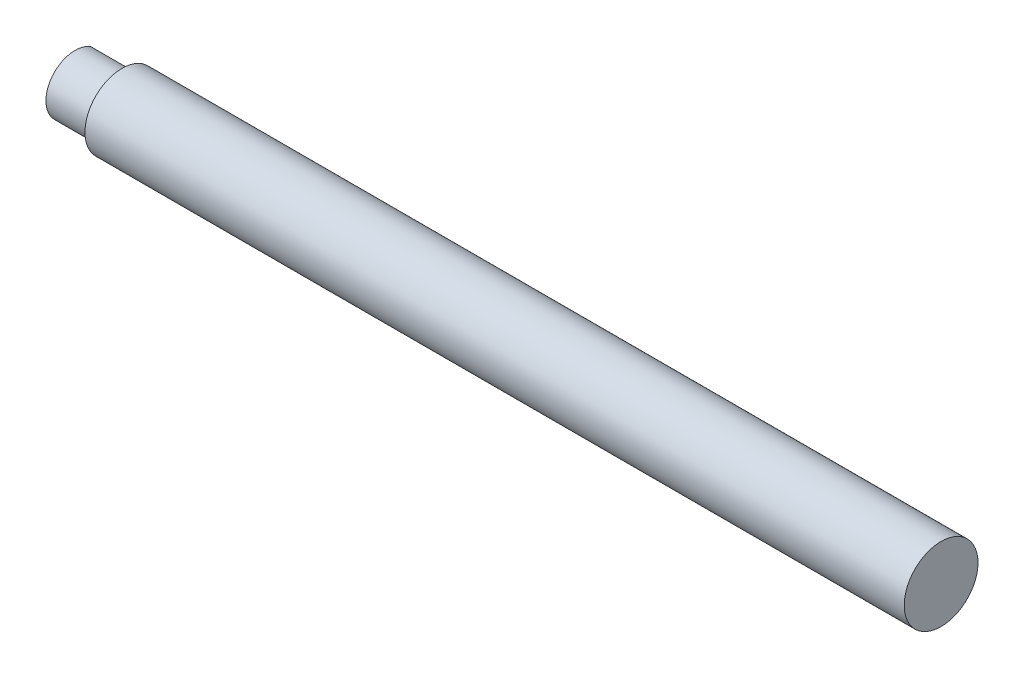
ISO-10303-21;
HEADER;
FILE_DESCRIPTION(('STEP AP214'),'2;1');
FILE_NAME('part.step','',(''),(''),'','','');
FILE_SCHEMA(('AUTOMOTIVE_DESIGN { 1 0 10303 214 1 1 1 1 }'));
ENDSEC;
DATA;
#1=APPLICATION_CONTEXT('core data for automotive mechanical design processes');
#2=APPLICATION_PROTOCOL_DEFINITION('international standard','automotive_design',2000,#1);
#3=PRODUCT_CONTEXT('',#1,'mechanical');
#4=PRODUCT('Part','Part','',(#3));
#5=PRODUCT_RELATED_PRODUCT_CATEGORY('part','',(#4));
#6=PRODUCT_DEFINITION_FORMATION('','',#4);
#7=PRODUCT_DEFINITION_CONTEXT('part definition',#1,'design');
#8=PRODUCT_DEFINITION('design','',#6,#7);
#9=PRODUCT_DEFINITION_SHAPE('','',#8);
#10=(LENGTH_UNIT() NAMED_UNIT(*) SI_UNIT(.MILLI.,.METRE.));
#11=(NAMED_UNIT(*) PLANE_ANGLE_UNIT() SI_UNIT($,.RADIAN.));
#12=(NAMED_UNIT(*) SI_UNIT($,.STERADIAN.) SOLID_ANGLE_UNIT());
#13=UNCERTAINTY_MEASURE_WITH_UNIT(LENGTH_MEASURE(1.E-05),#10,'distance_accuracy_value','');
#14=(GEOMETRIC_REPRESENTATION_CONTEXT(3) GLOBAL_UNCERTAINTY_ASSIGNED_CONTEXT((#13)) GLOBAL_UNIT_ASSIGNED_CONTEXT((#10,
#11,#12)) REPRESENTATION_CONTEXT('',''));
#15=CARTESIAN_POINT('',(0.,0.,0.));
#16=DIRECTION('',(0.,0.,1.));
#17=DIRECTION('',(1.,0.,0.));
#18=AXIS2_PLACEMENT_3D('',#15,#16,#17);
#19=CARTESIAN_POINT('',(58.674,0.,0.));
#20=DIRECTION('',(-1.,0.,0.));
#21=DIRECTION('',(0.,0.,1.));
#22=AXIS2_PLACEMENT_3D('',#19,#20,#21);
#23=CYLINDRICAL_SURFACE('',#22,2.5);
#24=CARTESIAN_POINT('',(3.175,0.,0.));
#25=DIRECTION('',(1.,0.,0.));
#26=DIRECTION('',(0.,0.,-1.));
#27=AXIS2_PLACEMENT_3D('',#24,#25,#26);
#28=CIRCLE('',#27,2.5);
#29=CARTESIAN_POINT('',(3.175,0.,-2.5));
#30=VERTEX_POINT('',#29);
#31=EDGE_CURVE('E37',#30,#30,#28,.T.);
#32=ORIENTED_EDGE('',*,*,#31,.T.);
#33=EDGE_LOOP('',(#32));
#34=FACE_BOUND('',#33,.T.);
#35=CARTESIAN_POINT('',(58.674,0.,0.));
#36=DIRECTION('',(1.,0.,0.));
#37=DIRECTION('',(0.,0.,-1.));
#38=AXIS2_PLACEMENT_3D('',#35,#36,#37);
#39=CIRCLE('',#38,2.5);
#40=CARTESIAN_POINT('',(58.674,0.,-2.5));
#41=VERTEX_POINT('',#40);
#42=EDGE_CURVE('E12',#41,#41,#39,.T.);
#43=ORIENTED_EDGE('',*,*,#42,.F.);
#44=EDGE_LOOP('',(#43));
#45=FACE_BOUND('',#44,.T.);
#46=ADVANCED_FACE('F34',(#34,#45),#23,.T.);
#47=CARTESIAN_POINT('',(58.674,0.,0.));
#48=DIRECTION('',(1.,0.,0.));
#49=DIRECTION('',(0.,0.,-1.));
#50=AXIS2_PLACEMENT_3D('',#47,#48,#49);
#51=PLANE('',#50);
#52=ORIENTED_EDGE('',*,*,#42,.T.);
#53=EDGE_LOOP('',(#52));
#54=FACE_BOUND('',#53,.T.);
#55=ADVANCED_FACE('F83',(#54),#51,.T.);
#56=CARTESIAN_POINT('',(3.175,0.,0.));
#57=DIRECTION('',(1.,0.,0.));
#58=DIRECTION('',(0.,0.,-1.));
#59=AXIS2_PLACEMENT_3D('',#56,#57,#58);
#60=PLANE('',#59);
#61=DIRECTION('',(0.,1.,0.));
#62=VECTOR('',#61,1.);
#63=CARTESIAN_POINT('',(3.175,1.6461081373956,-1.0795));
#64=LINE('',#63,#62);
#65=CARTESIAN_POINT('',(3.175,-1.6461081373956,-1.0795));
#66=VERTEX_POINT('',#65);
#67=CARTESIAN_POINT('',(3.175,1.6461081373956,-1.0795));
#68=VERTEX_POINT('',#67);
#69=EDGE_CURVE('E60',#66,#68,#64,.T.);
#70=ORIENTED_EDGE('',*,*,#69,.T.);
#71=CARTESIAN_POINT('',(3.175,0.,0.));
#72=DIRECTION('',(1.,0.,0.));
#73=DIRECTION('',(0.,0.,-1.));
#74=AXIS2_PLACEMENT_3D('',#71,#72,#73);
#75=CIRCLE('',#74,1.9685);
#76=EDGE_CURVE('E64',#68,#66,#75,.T.);
#77=ORIENTED_EDGE('',*,*,#76,.T.);
#78=EDGE_LOOP('',(#70,#77));
#79=FACE_BOUND('',#78,.T.);
#80=ORIENTED_EDGE('',*,*,#31,.F.);
#81=EDGE_LOOP('',(#80));
#82=FACE_BOUND('',#81,.T.);
#83=ADVANCED_FACE('F62',(#79,#82),#60,.F.);
#84=CARTESIAN_POINT('',(3.175,0.,0.));
#85=DIRECTION('',(-1.,0.,0.));
#86=DIRECTION('',(0.,0.,1.));
#87=AXIS2_PLACEMENT_3D('',#84,#85,#86);
#88=CYLINDRICAL_SURFACE('',#87,1.9685);
#89=CARTESIAN_POINT('',(0.,0.,0.));
#90=DIRECTION('',(1.,0.,0.));
#91=DIRECTION('',(0.,0.,-1.));
#92=AXIS2_PLACEMENT_3D('',#89,#90,#91);
#93=CIRCLE('',#92,1.9685);
#94=CARTESIAN_POINT('',(0.,1.6461081373956,-1.0795));
#95=VERTEX_POINT('',#94);
#96=CARTESIAN_POINT('',(0.,-1.6461081373956,-1.0795));
#97=VERTEX_POINT('',#96);
#98=EDGE_CURVE('E48',#95,#97,#93,.T.);
#99=ORIENTED_EDGE('',*,*,#98,.T.);
#100=DIRECTION('',(-1.,0.,0.));
#101=VECTOR('',#100,1.);
#102=CARTESIAN_POINT('',(3.175,-1.6461081373956,-1.0795));
#103=LINE('',#102,#101);
#104=EDGE_CURVE('E52',#66,#97,#103,.T.);
#105=ORIENTED_EDGE('',*,*,#104,.F.);
#106=ORIENTED_EDGE('',*,*,#76,.F.);
#107=DIRECTION('',(-1.,0.,0.));
#108=VECTOR('',#107,1.);
#109=CARTESIAN_POINT('',(3.175,1.6461081373956,-1.0795));
#110=LINE('',#109,#108);
#111=EDGE_CURVE('E66',#68,#95,#110,.T.);
#112=ORIENTED_EDGE('',*,*,#111,.T.);
#113=EDGE_LOOP('',(#99,#105,#106,#112));
#114=FACE_BOUND('',#113,.T.);
#115=ADVANCED_FACE('F73',(#114),#88,.T.);
#116=CARTESIAN_POINT('',(3.175,1.6461081373956,-1.0795));
#117=DIRECTION('',(0.,0.,1.));
#118=DIRECTION('',(1.,0.,0.));
#119=AXIS2_PLACEMENT_3D('',#116,#117,#118);
#120=PLANE('',#119);
#121=DIRECTION('',(0.,1.,0.));
#122=VECTOR('',#121,1.);
#123=CARTESIAN_POINT('',(0.,1.6461081373956,-1.0795));
#124=LINE('',#123,#122);
#125=EDGE_CURVE('E71',#97,#95,#124,.T.);
#126=ORIENTED_EDGE('',*,*,#125,.T.);
#127=ORIENTED_EDGE('',*,*,#111,.F.);
#128=ORIENTED_EDGE('',*,*,#69,.F.);
#129=ORIENTED_EDGE('',*,*,#104,.T.);
#130=EDGE_LOOP('',(#126,#127,#128,#129));
#131=FACE_BOUND('',#130,.T.);
#132=ADVANCED_FACE('F69',(#131),#120,.F.);
#133=CARTESIAN_POINT('',(0.,0.,0.));
#134=DIRECTION('',(1.,0.,0.));
#135=DIRECTION('',(0.,0.,-1.));
#136=AXIS2_PLACEMENT_3D('',#133,#134,#135);
#137=PLANE('',#136);
#138=ORIENTED_EDGE('',*,*,#125,.F.);
#139=ORIENTED_EDGE('',*,*,#98,.F.);
#140=EDGE_LOOP('',(#138,#139));
#141=FACE_BOUND('',#140,.T.);
#142=ADVANCED_FACE('F106',(#141),#137,.F.);
#143=CLOSED_SHELL('',(#46,#55,#83,#115,#132,#142));
#144=MANIFOLD_SOLID_BREP('B2',#143);
#145=ADVANCED_BREP_SHAPE_REPRESENTATION('',(#18,#144),#14);
#146=SHAPE_DEFINITION_REPRESENTATION(#9,#145);
ENDSEC;
END-ISO-10303-21;
